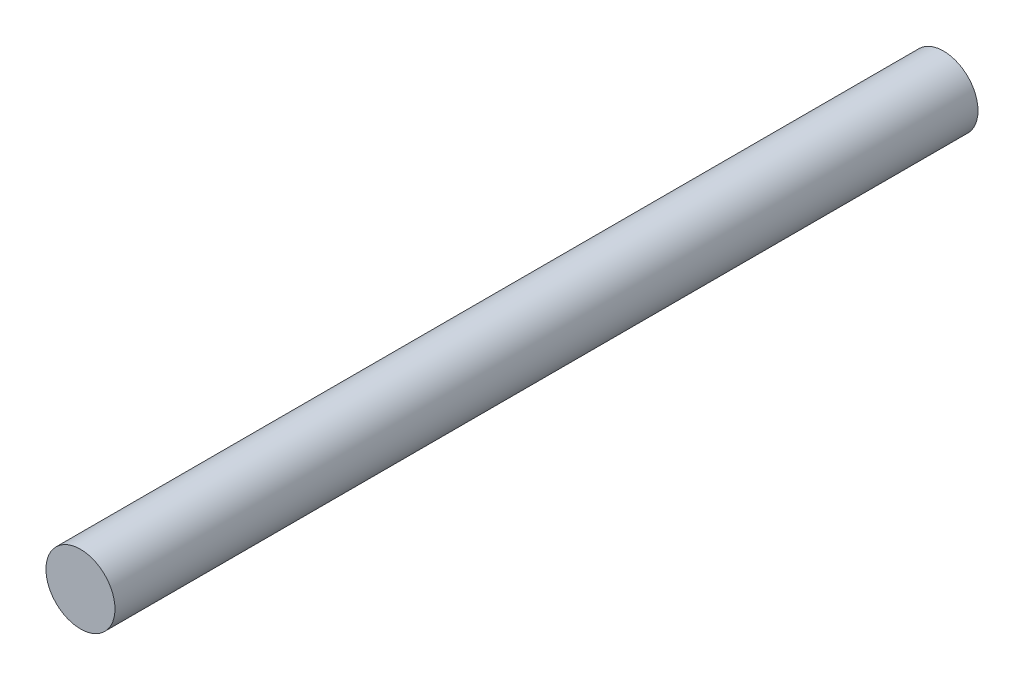
ISO-10303-21;
HEADER;
FILE_DESCRIPTION(('STEP AP214'),'2;1');
FILE_NAME('part.step','',(''),(''),'','','');
FILE_SCHEMA(('AUTOMOTIVE_DESIGN { 1 0 10303 214 1 1 1 1 }'));
ENDSEC;
DATA;
#1=APPLICATION_CONTEXT('core data for automotive mechanical design processes');
#2=APPLICATION_PROTOCOL_DEFINITION('international standard','automotive_design',2000,#1);
#3=PRODUCT_CONTEXT('',#1,'mechanical');
#4=PRODUCT('Part','Part','',(#3));
#5=PRODUCT_RELATED_PRODUCT_CATEGORY('part','',(#4));
#6=PRODUCT_DEFINITION_FORMATION('','',#4);
#7=PRODUCT_DEFINITION_CONTEXT('part definition',#1,'design');
#8=PRODUCT_DEFINITION('design','',#6,#7);
#9=PRODUCT_DEFINITION_SHAPE('','',#8);
#10=(LENGTH_UNIT() NAMED_UNIT(*) SI_UNIT(.MILLI.,.METRE.));
#11=(NAMED_UNIT(*) PLANE_ANGLE_UNIT() SI_UNIT($,.RADIAN.));
#12=(NAMED_UNIT(*) SI_UNIT($,.STERADIAN.) SOLID_ANGLE_UNIT());
#13=UNCERTAINTY_MEASURE_WITH_UNIT(LENGTH_MEASURE(1.E-05),#10,'distance_accuracy_value','');
#14=(GEOMETRIC_REPRESENTATION_CONTEXT(3) GLOBAL_UNCERTAINTY_ASSIGNED_CONTEXT((#13)) GLOBAL_UNIT_ASSIGNED_CONTEXT((#10,
#11,#12)) REPRESENTATION_CONTEXT('',''));
#15=CARTESIAN_POINT('',(0.,0.,0.));
#16=DIRECTION('',(0.,0.,1.));
#17=DIRECTION('',(1.,0.,0.));
#18=AXIS2_PLACEMENT_3D('',#15,#16,#17);
#19=CARTESIAN_POINT('',(0.,0.,65.));
#20=DIRECTION('',(0.,0.,-1.));
#21=DIRECTION('',(-1.,0.,0.));
#22=AXIS2_PLACEMENT_3D('',#19,#20,#21);
#23=CYLINDRICAL_SURFACE('',#22,2.6);
#24=CARTESIAN_POINT('',(0.,0.,65.));
#25=DIRECTION('',(0.,0.,1.));
#26=DIRECTION('',(1.,0.,0.));
#27=AXIS2_PLACEMENT_3D('',#24,#25,#26);
#28=CIRCLE('',#27,2.6);
#29=CARTESIAN_POINT('',(2.6,0.,65.));
#30=VERTEX_POINT('',#29);
#31=EDGE_CURVE('E10',#30,#30,#28,.T.);
#32=ORIENTED_EDGE('',*,*,#31,.F.);
#33=EDGE_LOOP('',(#32));
#34=FACE_BOUND('',#33,.T.);
#35=CARTESIAN_POINT('',(0.,0.,0.));
#36=DIRECTION('',(0.,0.,1.));
#37=DIRECTION('',(1.,0.,0.));
#38=AXIS2_PLACEMENT_3D('',#35,#36,#37);
#39=CIRCLE('',#38,2.6);
#40=CARTESIAN_POINT('',(2.6,0.,0.));
#41=VERTEX_POINT('',#40);
#42=EDGE_CURVE('E46',#41,#41,#39,.T.);
#43=ORIENTED_EDGE('',*,*,#42,.T.);
#44=EDGE_LOOP('',(#43));
#45=FACE_BOUND('',#44,.T.);
#46=ADVANCED_FACE('F43',(#34,#45),#23,.T.);
#47=CARTESIAN_POINT('',(0.,0.,65.));
#48=DIRECTION('',(0.,0.,1.));
#49=DIRECTION('',(1.,0.,0.));
#50=AXIS2_PLACEMENT_3D('',#47,#48,#49);
#51=PLANE('',#50);
#52=ORIENTED_EDGE('',*,*,#31,.T.);
#53=EDGE_LOOP('',(#52));
#54=FACE_BOUND('',#53,.T.);
#55=ADVANCED_FACE('F58',(#54),#51,.T.);
#56=CARTESIAN_POINT('',(0.,0.,0.));
#57=DIRECTION('',(0.,0.,1.));
#58=DIRECTION('',(1.,0.,0.));
#59=AXIS2_PLACEMENT_3D('',#56,#57,#58);
#60=PLANE('',#59);
#61=ORIENTED_EDGE('',*,*,#42,.F.);
#62=EDGE_LOOP('',(#61));
#63=FACE_BOUND('',#62,.T.);
#64=ADVANCED_FACE('F59',(#63),#60,.F.);
#65=CLOSED_SHELL('',(#46,#55,#64));
#66=MANIFOLD_SOLID_BREP('B2',#65);
#67=ADVANCED_BREP_SHAPE_REPRESENTATION('',(#18,#66),#14);
#68=SHAPE_DEFINITION_REPRESENTATION(#9,#67);
ENDSEC;
END-ISO-10303-21;
